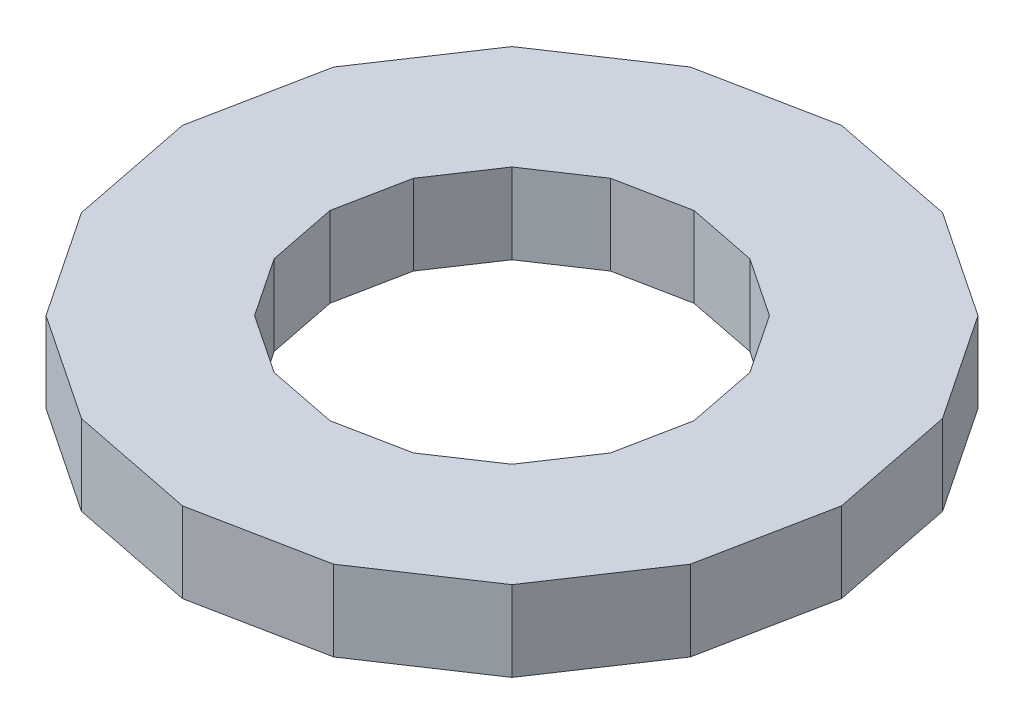
ISO-10303-21;
HEADER;
FILE_DESCRIPTION(('STEP AP214'),'2;1');
FILE_NAME('part.step','',(''),(''),'','','');
FILE_SCHEMA(('AUTOMOTIVE_DESIGN { 1 0 10303 214 1 1 1 1 }'));
ENDSEC;
DATA;
#1=APPLICATION_CONTEXT('core data for automotive mechanical design processes');
#2=APPLICATION_PROTOCOL_DEFINITION('international standard','automotive_design',2000,#1);
#3=PRODUCT_CONTEXT('',#1,'mechanical');
#4=PRODUCT('Part','Part','',(#3));
#5=PRODUCT_RELATED_PRODUCT_CATEGORY('part','',(#4));
#6=PRODUCT_DEFINITION_FORMATION('','',#4);
#7=PRODUCT_DEFINITION_CONTEXT('part definition',#1,'design');
#8=PRODUCT_DEFINITION('design','',#6,#7);
#9=PRODUCT_DEFINITION_SHAPE('','',#8);
#10=(LENGTH_UNIT() NAMED_UNIT(*) SI_UNIT(.MILLI.,.METRE.));
#11=(NAMED_UNIT(*) PLANE_ANGLE_UNIT() SI_UNIT($,.RADIAN.));
#12=(NAMED_UNIT(*) SI_UNIT($,.STERADIAN.) SOLID_ANGLE_UNIT());
#13=UNCERTAINTY_MEASURE_WITH_UNIT(LENGTH_MEASURE(1.E-05),#10,'distance_accuracy_value','');
#14=(GEOMETRIC_REPRESENTATION_CONTEXT(3) GLOBAL_UNCERTAINTY_ASSIGNED_CONTEXT((#13)) GLOBAL_UNIT_ASSIGNED_CONTEXT((#10,
#11,#12)) REPRESENTATION_CONTEXT('',''));
#15=CARTESIAN_POINT('',(0.,0.,0.));
#16=DIRECTION('',(0.,0.,1.));
#17=DIRECTION('',(1.,0.,0.));
#18=AXIS2_PLACEMENT_3D('',#15,#16,#17);
#19=CARTESIAN_POINT('',(0.,19.05,0.));
#20=DIRECTION('',(0.,1.,0.));
#21=DIRECTION('',(0.,0.,1.));
#22=AXIS2_PLACEMENT_3D('',#19,#20,#21);
#23=PLANE('',#22);
#24=DIRECTION('',(-0.195090322016129,0.,0.98078528040323));
#25=VECTOR('',#24,1.);
#26=CARTESIAN_POINT('',(-72.1713098321094,19.05,-29.8943353466904));
#27=LINE('',#26,#25);
#28=CARTESIAN_POINT('',(-72.1713098321094,19.05,-29.8943353466904));
#29=VERTEX_POINT('',#28);
#30=CARTESIAN_POINT('',(-78.117662847161,19.05,0.));
#31=VERTEX_POINT('',#30);
#32=EDGE_CURVE('E363',#29,#31,#27,.T.);
#33=ORIENTED_EDGE('',*,*,#32,.T.);
#34=DIRECTION('',(0.195090322016128,0.,0.980785280403231));
#35=VECTOR('',#34,1.);
#36=CARTESIAN_POINT('',(-78.117662847161,19.05,0.));
#37=LINE('',#36,#35);
#38=CARTESIAN_POINT('',(-72.1713098321094,19.05,29.8943353466904));
#39=VERTEX_POINT('',#38);
#40=EDGE_CURVE('E366',#31,#39,#37,.T.);
#41=ORIENTED_EDGE('',*,*,#40,.T.);
#42=DIRECTION('',(0.555570233019602,0.,0.831469612302546));
#43=VECTOR('',#42,1.);
#44=CARTESIAN_POINT('',(-72.1713098321094,19.05,29.8943353466904));
#45=LINE('',#44,#43);
#46=CARTESIAN_POINT('',(-55.2375291296719,19.05,55.237529129672));
#47=VERTEX_POINT('',#46);
#48=EDGE_CURVE('E369',#39,#47,#45,.T.);
#49=ORIENTED_EDGE('',*,*,#48,.T.);
#50=DIRECTION('',(0.831469612302545,0.,0.555570233019603));
#51=VECTOR('',#50,1.);
#52=CARTESIAN_POINT('',(-55.2375291296719,19.05,55.237529129672));
#53=LINE('',#52,#51);
#54=CARTESIAN_POINT('',(-29.8943353466904,19.05,72.1713098321094));
#55=VERTEX_POINT('',#54);
#56=EDGE_CURVE('E371',#47,#55,#53,.T.);
#57=ORIENTED_EDGE('',*,*,#56,.T.);
#58=DIRECTION('',(0.98078528040323,0.,0.195090322016128));
#59=VECTOR('',#58,1.);
#60=CARTESIAN_POINT('',(-29.8943353466904,19.05,72.1713098321094));
#61=LINE('',#60,#59);
#62=CARTESIAN_POINT('',(0.,19.05,78.117662847161));
#63=VERTEX_POINT('',#62);
#64=EDGE_CURVE('E373',#55,#63,#61,.T.);
#65=ORIENTED_EDGE('',*,*,#64,.T.);
#66=DIRECTION('',(0.980785280403231,0.,-0.195090322016128));
#67=VECTOR('',#66,1.);
#68=CARTESIAN_POINT('',(0.,19.05,78.117662847161));
#69=LINE('',#68,#67);
#70=CARTESIAN_POINT('',(29.8943353466903,19.05,72.1713098321095));
#71=VERTEX_POINT('',#70);
#72=EDGE_CURVE('E375',#63,#71,#69,.T.);
#73=ORIENTED_EDGE('',*,*,#72,.T.);
#74=DIRECTION('',(0.831469612302545,0.,-0.555570233019602));
#75=VECTOR('',#74,1.);
#76=CARTESIAN_POINT('',(29.8943353466903,19.05,72.1713098321095));
#77=LINE('',#76,#75);
#78=CARTESIAN_POINT('',(55.2375291296719,19.05,55.237529129672));
#79=VERTEX_POINT('',#78);
#80=EDGE_CURVE('E377',#71,#79,#77,.T.);
#81=ORIENTED_EDGE('',*,*,#80,.T.);
#82=DIRECTION('',(0.555570233019602,0.,-0.831469612302545));
#83=VECTOR('',#82,1.);
#84=CARTESIAN_POINT('',(55.2375291296719,19.05,55.237529129672));
#85=LINE('',#84,#83);
#86=CARTESIAN_POINT('',(72.1713098321094,19.05,29.8943353466905));
#87=VERTEX_POINT('',#86);
#88=EDGE_CURVE('E379',#79,#87,#85,.T.);
#89=ORIENTED_EDGE('',*,*,#88,.T.);
#90=DIRECTION('',(0.195090322016128,0.,-0.980785280403231));
#91=VECTOR('',#90,1.);
#92=CARTESIAN_POINT('',(72.1713098321094,19.05,29.8943353466905));
#93=LINE('',#92,#91);
#94=CARTESIAN_POINT('',(78.117662847161,19.05,0.));
#95=VERTEX_POINT('',#94);
#96=EDGE_CURVE('E381',#87,#95,#93,.T.);
#97=ORIENTED_EDGE('',*,*,#96,.T.);
#98=DIRECTION('',(-0.195090322016127,0.,-0.980785280403231));
#99=VECTOR('',#98,1.);
#100=CARTESIAN_POINT('',(78.117662847161,19.05,0.));
#101=LINE('',#100,#99);
#102=CARTESIAN_POINT('',(72.1713098321094,19.05,-29.8943353466903));
#103=VERTEX_POINT('',#102);
#104=EDGE_CURVE('E383',#95,#103,#101,.T.);
#105=ORIENTED_EDGE('',*,*,#104,.T.);
#106=DIRECTION('',(-0.555570233019602,0.,-0.831469612302545));
#107=VECTOR('',#106,1.);
#108=CARTESIAN_POINT('',(72.1713098321094,19.05,-29.8943353466903));
#109=LINE('',#108,#107);
#110=CARTESIAN_POINT('',(55.237529129672,19.05,-55.2375291296719));
#111=VERTEX_POINT('',#110);
#112=EDGE_CURVE('E385',#103,#111,#109,.T.);
#113=ORIENTED_EDGE('',*,*,#112,.T.);
#114=DIRECTION('',(-0.831469612302545,0.,-0.555570233019603));
#115=VECTOR('',#114,1.);
#116=CARTESIAN_POINT('',(55.237529129672,19.05,-55.2375291296719));
#117=LINE('',#116,#115);
#118=CARTESIAN_POINT('',(29.8943353466904,19.05,-72.1713098321094));
#119=VERTEX_POINT('',#118);
#120=EDGE_CURVE('E387',#111,#119,#117,.T.);
#121=ORIENTED_EDGE('',*,*,#120,.T.);
#122=DIRECTION('',(-0.98078528040323,0.,-0.195090322016128));
#123=VECTOR('',#122,1.);
#124=CARTESIAN_POINT('',(29.8943353466904,19.05,-72.1713098321094));
#125=LINE('',#124,#123);
#126=CARTESIAN_POINT('',(0.,19.05,-78.1176628471609));
#127=VERTEX_POINT('',#126);
#128=EDGE_CURVE('E389',#119,#127,#125,.T.);
#129=ORIENTED_EDGE('',*,*,#128,.T.);
#130=DIRECTION('',(-0.980785280403231,0.,0.195090322016128));
#131=VECTOR('',#130,1.);
#132=CARTESIAN_POINT('',(0.,19.05,-78.1176628471609));
#133=LINE('',#132,#131);
#134=CARTESIAN_POINT('',(-29.8943353466904,19.05,-72.1713098321094));
#135=VERTEX_POINT('',#134);
#136=EDGE_CURVE('E391',#127,#135,#133,.T.);
#137=ORIENTED_EDGE('',*,*,#136,.T.);
#138=DIRECTION('',(-0.831469612302546,0.,0.555570233019601));
#139=VECTOR('',#138,1.);
#140=CARTESIAN_POINT('',(-29.8943353466904,19.05,-72.1713098321094));
#141=LINE('',#140,#139);
#142=CARTESIAN_POINT('',(-55.2375291296719,19.05,-55.237529129672));
#143=VERTEX_POINT('',#142);
#144=EDGE_CURVE('E393',#135,#143,#141,.T.);
#145=ORIENTED_EDGE('',*,*,#144,.T.);
#146=DIRECTION('',(-0.555570233019602,0.,0.831469612302545));
#147=VECTOR('',#146,1.);
#148=CARTESIAN_POINT('',(-55.2375291296719,19.05,-55.237529129672));
#149=LINE('',#148,#147);
#150=EDGE_CURVE('E395',#143,#29,#149,.T.);
#151=ORIENTED_EDGE('',*,*,#150,.T.);
#152=EDGE_LOOP('',(#33,#41,#49,#57,#65,#73,#81,#89,#97,#105,#113,#121,#129,#137,#145,#151));
#153=FACE_BOUND('',#152,.T.);
#154=DIRECTION('',(0.195090322016128,0.,0.980785280403231));
#155=VECTOR('',#154,1.);
#156=CARTESIAN_POINT('',(-43.1558820321981,19.05,0.));
#157=LINE('',#156,#155);
#158=CARTESIAN_POINT('',(-43.1558820321981,19.05,0.));
#159=VERTEX_POINT('',#158);
#160=CARTESIAN_POINT('',(-39.8708361170195,19.05,16.5150410628245));
#161=VERTEX_POINT('',#160);
#162=EDGE_CURVE('E250',#159,#161,#157,.T.);
#163=ORIENTED_EDGE('',*,*,#162,.F.);
#164=DIRECTION('',(-0.195090322016127,0.,0.980785280403231));
#165=VECTOR('',#164,1.);
#166=CARTESIAN_POINT('',(-39.8708361170195,19.05,-16.5150410628244));
#167=LINE('',#166,#165);
#168=CARTESIAN_POINT('',(-39.8708361170195,19.05,-16.5150410628244));
#169=VERTEX_POINT('',#168);
#170=EDGE_CURVE('E242',#169,#159,#167,.T.);
#171=ORIENTED_EDGE('',*,*,#170,.F.);
#172=DIRECTION('',(-0.555570233019601,0.,0.831469612302546));
#173=VECTOR('',#172,1.);
#174=CARTESIAN_POINT('',(-30.515816833054,19.05,-30.515816833054));
#175=LINE('',#174,#173);
#176=CARTESIAN_POINT('',(-30.515816833054,19.05,-30.515816833054));
#177=VERTEX_POINT('',#176);
#178=EDGE_CURVE('E291',#177,#169,#175,.T.);
#179=ORIENTED_EDGE('',*,*,#178,.F.);
#180=DIRECTION('',(-0.831469612302545,0.,0.555570233019603));
#181=VECTOR('',#180,1.);
#182=CARTESIAN_POINT('',(-16.5150410628245,19.05,-39.8708361170195));
#183=LINE('',#182,#181);
#184=CARTESIAN_POINT('',(-16.5150410628245,19.05,-39.8708361170195));
#185=VERTEX_POINT('',#184);
#186=EDGE_CURVE('E289',#185,#177,#183,.T.);
#187=ORIENTED_EDGE('',*,*,#186,.F.);
#188=DIRECTION('',(-0.98078528040323,0.,0.195090322016129));
#189=VECTOR('',#188,1.);
#190=CARTESIAN_POINT('',(0.,19.05,-43.1558820321982));
#191=LINE('',#190,#189);
#192=CARTESIAN_POINT('',(0.,19.05,-43.1558820321982));
#193=VERTEX_POINT('',#192);
#194=EDGE_CURVE('E287',#193,#185,#191,.T.);
#195=ORIENTED_EDGE('',*,*,#194,.F.);
#196=DIRECTION('',(-0.980785280403231,0.,-0.195090322016128));
#197=VECTOR('',#196,1.);
#198=CARTESIAN_POINT('',(16.5150410628244,19.05,-39.8708361170195));
#199=LINE('',#198,#197);
#200=CARTESIAN_POINT('',(16.5150410628244,19.05,-39.8708361170195));
#201=VERTEX_POINT('',#200);
#202=EDGE_CURVE('E285',#201,#193,#199,.T.);
#203=ORIENTED_EDGE('',*,*,#202,.F.);
#204=DIRECTION('',(-0.831469612302546,0.,-0.555570233019601));
#205=VECTOR('',#204,1.);
#206=CARTESIAN_POINT('',(30.5158168330539,19.05,-30.515816833054));
#207=LINE('',#206,#205);
#208=CARTESIAN_POINT('',(30.5158168330539,19.05,-30.515816833054));
#209=VERTEX_POINT('',#208);
#210=EDGE_CURVE('E283',#209,#201,#207,.T.);
#211=ORIENTED_EDGE('',*,*,#210,.F.);
#212=DIRECTION('',(-0.555570233019603,0.,-0.831469612302545));
#213=VECTOR('',#212,1.);
#214=CARTESIAN_POINT('',(39.8708361170194,19.05,-16.5150410628245));
#215=LINE('',#214,#213);
#216=CARTESIAN_POINT('',(39.8708361170194,19.05,-16.5150410628245));
#217=VERTEX_POINT('',#216);
#218=EDGE_CURVE('E281',#217,#209,#215,.T.);
#219=ORIENTED_EDGE('',*,*,#218,.F.);
#220=DIRECTION('',(-0.195090322016129,0.,-0.98078528040323));
#221=VECTOR('',#220,1.);
#222=CARTESIAN_POINT('',(43.1558820321981,19.05,0.));
#223=LINE('',#222,#221);
#224=CARTESIAN_POINT('',(43.1558820321981,19.05,0.));
#225=VERTEX_POINT('',#224);
#226=EDGE_CURVE('E279',#225,#217,#223,.T.);
#227=ORIENTED_EDGE('',*,*,#226,.F.);
#228=DIRECTION('',(0.195090322016128,0.,-0.980785280403231));
#229=VECTOR('',#228,1.);
#230=CARTESIAN_POINT('',(39.8708361170195,19.05,16.5150410628245));
#231=LINE('',#230,#229);
#232=CARTESIAN_POINT('',(39.8708361170195,19.05,16.5150410628245));
#233=VERTEX_POINT('',#232);
#234=EDGE_CURVE('E277',#233,#225,#231,.T.);
#235=ORIENTED_EDGE('',*,*,#234,.F.);
#236=DIRECTION('',(0.555570233019601,0.,-0.831469612302546));
#237=VECTOR('',#236,1.);
#238=CARTESIAN_POINT('',(30.515816833054,19.05,30.515816833054));
#239=LINE('',#238,#237);
#240=CARTESIAN_POINT('',(30.515816833054,19.05,30.515816833054));
#241=VERTEX_POINT('',#240);
#242=EDGE_CURVE('E275',#241,#233,#239,.T.);
#243=ORIENTED_EDGE('',*,*,#242,.F.);
#244=DIRECTION('',(0.831469612302545,0.,-0.555570233019603));
#245=VECTOR('',#244,1.);
#246=CARTESIAN_POINT('',(16.5150410628245,19.05,39.8708361170194));
#247=LINE('',#246,#245);
#248=CARTESIAN_POINT('',(16.5150410628245,19.05,39.8708361170194));
#249=VERTEX_POINT('',#248);
#250=EDGE_CURVE('E273',#249,#241,#247,.T.);
#251=ORIENTED_EDGE('',*,*,#250,.F.);
#252=DIRECTION('',(0.98078528040323,0.,-0.195090322016129));
#253=VECTOR('',#252,1.);
#254=CARTESIAN_POINT('',(0.,19.05,43.1558820321981));
#255=LINE('',#254,#253);
#256=CARTESIAN_POINT('',(0.,19.05,43.1558820321981));
#257=VERTEX_POINT('',#256);
#258=EDGE_CURVE('E271',#257,#249,#255,.T.);
#259=ORIENTED_EDGE('',*,*,#258,.F.);
#260=DIRECTION('',(0.980785280403231,0.,0.195090322016127));
#261=VECTOR('',#260,1.);
#262=CARTESIAN_POINT('',(-16.5150410628244,19.05,39.8708361170195));
#263=LINE('',#262,#261);
#264=CARTESIAN_POINT('',(-16.5150410628244,19.05,39.8708361170195));
#265=VERTEX_POINT('',#264);
#266=EDGE_CURVE('E269',#265,#257,#263,.T.);
#267=ORIENTED_EDGE('',*,*,#266,.F.);
#268=DIRECTION('',(0.831469612302546,0.,0.555570233019601));
#269=VECTOR('',#268,1.);
#270=CARTESIAN_POINT('',(-30.515816833054,19.05,30.515816833054));
#271=LINE('',#270,#269);
#272=CARTESIAN_POINT('',(-30.515816833054,19.05,30.515816833054));
#273=VERTEX_POINT('',#272);
#274=EDGE_CURVE('E265',#273,#265,#271,.T.);
#275=ORIENTED_EDGE('',*,*,#274,.F.);
#276=DIRECTION('',(0.555570233019603,0.,0.831469612302544));
#277=VECTOR('',#276,1.);
#278=CARTESIAN_POINT('',(-39.8708361170195,19.05,16.5150410628245));
#279=LINE('',#278,#277);
#280=EDGE_CURVE('E263',#161,#273,#279,.T.);
#281=ORIENTED_EDGE('',*,*,#280,.F.);
#282=EDGE_LOOP('',(#163,#171,#179,#187,#195,#203,#211,#219,#227,#235,#243,#251,#259,#267,#275,#281));
#283=FACE_BOUND('',#282,.T.);
#284=ADVANCED_FACE('F33',(#153,#283),#23,.T.);
#285=CARTESIAN_POINT('',(0.,0.,0.));
#286=DIRECTION('',(0.,1.,0.));
#287=DIRECTION('',(0.,0.,1.));
#288=AXIS2_PLACEMENT_3D('',#285,#286,#287);
#289=PLANE('',#288);
#290=DIRECTION('',(-0.195090322016129,0.,0.98078528040323));
#291=VECTOR('',#290,1.);
#292=CARTESIAN_POINT('',(-72.1713098321094,0.,-29.8943353466904));
#293=LINE('',#292,#291);
#294=CARTESIAN_POINT('',(-72.1713098321094,0.,-29.8943353466904));
#295=VERTEX_POINT('',#294);
#296=CARTESIAN_POINT('',(-78.117662847161,0.,0.));
#297=VERTEX_POINT('',#296);
#298=EDGE_CURVE('E258',#295,#297,#293,.T.);
#299=ORIENTED_EDGE('',*,*,#298,.F.);
#300=DIRECTION('',(-0.555570233019602,0.,0.831469612302545));
#301=VECTOR('',#300,1.);
#302=CARTESIAN_POINT('',(-55.2375291296719,0.,-55.237529129672));
#303=LINE('',#302,#301);
#304=CARTESIAN_POINT('',(-55.2375291296719,0.,-55.237529129672));
#305=VERTEX_POINT('',#304);
#306=EDGE_CURVE('E367',#305,#295,#303,.T.);
#307=ORIENTED_EDGE('',*,*,#306,.F.);
#308=DIRECTION('',(-0.831469612302546,0.,0.555570233019601));
#309=VECTOR('',#308,1.);
#310=CARTESIAN_POINT('',(-29.8943353466904,0.,-72.1713098321094));
#311=LINE('',#310,#309);
#312=CARTESIAN_POINT('',(-29.8943353466904,0.,-72.1713098321094));
#313=VERTEX_POINT('',#312);
#314=EDGE_CURVE('E426',#313,#305,#311,.T.);
#315=ORIENTED_EDGE('',*,*,#314,.F.);
#316=DIRECTION('',(-0.980785280403231,0.,0.195090322016128));
#317=VECTOR('',#316,1.);
#318=CARTESIAN_POINT('',(0.,0.,-78.1176628471609));
#319=LINE('',#318,#317);
#320=CARTESIAN_POINT('',(0.,0.,-78.1176628471609));
#321=VERTEX_POINT('',#320);
#322=EDGE_CURVE('E424',#321,#313,#319,.T.);
#323=ORIENTED_EDGE('',*,*,#322,.F.);
#324=DIRECTION('',(-0.98078528040323,0.,-0.195090322016128));
#325=VECTOR('',#324,1.);
#326=CARTESIAN_POINT('',(29.8943353466904,0.,-72.1713098321094));
#327=LINE('',#326,#325);
#328=CARTESIAN_POINT('',(29.8943353466904,0.,-72.1713098321094));
#329=VERTEX_POINT('',#328);
#330=EDGE_CURVE('E422',#329,#321,#327,.T.);
#331=ORIENTED_EDGE('',*,*,#330,.F.);
#332=DIRECTION('',(-0.831469612302545,0.,-0.555570233019603));
#333=VECTOR('',#332,1.);
#334=CARTESIAN_POINT('',(55.237529129672,0.,-55.2375291296719));
#335=LINE('',#334,#333);
#336=CARTESIAN_POINT('',(55.237529129672,0.,-55.2375291296719));
#337=VERTEX_POINT('',#336);
#338=EDGE_CURVE('E420',#337,#329,#335,.T.);
#339=ORIENTED_EDGE('',*,*,#338,.F.);
#340=DIRECTION('',(-0.555570233019602,0.,-0.831469612302545));
#341=VECTOR('',#340,1.);
#342=CARTESIAN_POINT('',(72.1713098321094,0.,-29.8943353466903));
#343=LINE('',#342,#341);
#344=CARTESIAN_POINT('',(72.1713098321094,0.,-29.8943353466903));
#345=VERTEX_POINT('',#344);
#346=EDGE_CURVE('E418',#345,#337,#343,.T.);
#347=ORIENTED_EDGE('',*,*,#346,.F.);
#348=DIRECTION('',(-0.195090322016127,0.,-0.980785280403231));
#349=VECTOR('',#348,1.);
#350=CARTESIAN_POINT('',(78.117662847161,0.,0.));
#351=LINE('',#350,#349);
#352=CARTESIAN_POINT('',(78.117662847161,0.,0.));
#353=VERTEX_POINT('',#352);
#354=EDGE_CURVE('E416',#353,#345,#351,.T.);
#355=ORIENTED_EDGE('',*,*,#354,.F.);
#356=DIRECTION('',(0.195090322016128,0.,-0.980785280403231));
#357=VECTOR('',#356,1.);
#358=CARTESIAN_POINT('',(72.1713098321094,0.,29.8943353466905));
#359=LINE('',#358,#357);
#360=CARTESIAN_POINT('',(72.1713098321094,0.,29.8943353466905));
#361=VERTEX_POINT('',#360);
#362=EDGE_CURVE('E414',#361,#353,#359,.T.);
#363=ORIENTED_EDGE('',*,*,#362,.F.);
#364=DIRECTION('',(0.555570233019602,0.,-0.831469612302545));
#365=VECTOR('',#364,1.);
#366=CARTESIAN_POINT('',(55.2375291296719,0.,55.237529129672));
#367=LINE('',#366,#365);
#368=CARTESIAN_POINT('',(55.2375291296719,0.,55.237529129672));
#369=VERTEX_POINT('',#368);
#370=EDGE_CURVE('E412',#369,#361,#367,.T.);
#371=ORIENTED_EDGE('',*,*,#370,.F.);
#372=DIRECTION('',(0.831469612302545,0.,-0.555570233019602));
#373=VECTOR('',#372,1.);
#374=CARTESIAN_POINT('',(29.8943353466903,0.,72.1713098321095));
#375=LINE('',#374,#373);
#376=CARTESIAN_POINT('',(29.8943353466903,0.,72.1713098321095));
#377=VERTEX_POINT('',#376);
#378=EDGE_CURVE('E410',#377,#369,#375,.T.);
#379=ORIENTED_EDGE('',*,*,#378,.F.);
#380=DIRECTION('',(0.980785280403231,0.,-0.195090322016128));
#381=VECTOR('',#380,1.);
#382=CARTESIAN_POINT('',(0.,0.,78.117662847161));
#383=LINE('',#382,#381);
#384=CARTESIAN_POINT('',(0.,0.,78.117662847161));
#385=VERTEX_POINT('',#384);
#386=EDGE_CURVE('E408',#385,#377,#383,.T.);
#387=ORIENTED_EDGE('',*,*,#386,.F.);
#388=DIRECTION('',(0.98078528040323,0.,0.195090322016128));
#389=VECTOR('',#388,1.);
#390=CARTESIAN_POINT('',(-29.8943353466904,0.,72.1713098321094));
#391=LINE('',#390,#389);
#392=CARTESIAN_POINT('',(-29.8943353466904,0.,72.1713098321094));
#393=VERTEX_POINT('',#392);
#394=EDGE_CURVE('E406',#393,#385,#391,.T.);
#395=ORIENTED_EDGE('',*,*,#394,.F.);
#396=DIRECTION('',(0.831469612302545,0.,0.555570233019603));
#397=VECTOR('',#396,1.);
#398=CARTESIAN_POINT('',(-55.2375291296719,0.,55.237529129672));
#399=LINE('',#398,#397);
#400=CARTESIAN_POINT('',(-55.2375291296719,0.,55.237529129672));
#401=VERTEX_POINT('',#400);
#402=EDGE_CURVE('E404',#401,#393,#399,.T.);
#403=ORIENTED_EDGE('',*,*,#402,.F.);
#404=DIRECTION('',(0.555570233019602,0.,0.831469612302546));
#405=VECTOR('',#404,1.);
#406=CARTESIAN_POINT('',(-72.1713098321094,0.,29.8943353466904));
#407=LINE('',#406,#405);
#408=CARTESIAN_POINT('',(-72.1713098321094,0.,29.8943353466904));
#409=VERTEX_POINT('',#408);
#410=EDGE_CURVE('E402',#409,#401,#407,.T.);
#411=ORIENTED_EDGE('',*,*,#410,.F.);
#412=DIRECTION('',(0.195090322016128,0.,0.980785280403231));
#413=VECTOR('',#412,1.);
#414=CARTESIAN_POINT('',(-78.117662847161,0.,0.));
#415=LINE('',#414,#413);
#416=EDGE_CURVE('E400',#297,#409,#415,.T.);
#417=ORIENTED_EDGE('',*,*,#416,.F.);
#418=EDGE_LOOP('',(#299,#307,#315,#323,#331,#339,#347,#355,#363,#371,#379,#387,#395,#403,#411,#417));
#419=FACE_BOUND('',#418,.T.);
#420=DIRECTION('',(-0.195090322016127,0.,0.980785280403231));
#421=VECTOR('',#420,1.);
#422=CARTESIAN_POINT('',(-39.8708361170195,0.,-16.5150410628244));
#423=LINE('',#422,#421);
#424=CARTESIAN_POINT('',(-39.8708361170195,0.,-16.5150410628244));
#425=VERTEX_POINT('',#424);
#426=CARTESIAN_POINT('',(-43.1558820321981,0.,0.));
#427=VERTEX_POINT('',#426);
#428=EDGE_CURVE('E56',#425,#427,#423,.T.);
#429=ORIENTED_EDGE('',*,*,#428,.T.);
#430=DIRECTION('',(0.195090322016128,0.,0.980785280403231));
#431=VECTOR('',#430,1.);
#432=CARTESIAN_POINT('',(-43.1558820321981,0.,0.));
#433=LINE('',#432,#431);
#434=CARTESIAN_POINT('',(-39.8708361170195,0.,16.5150410628245));
#435=VERTEX_POINT('',#434);
#436=EDGE_CURVE('E257',#427,#435,#433,.T.);
#437=ORIENTED_EDGE('',*,*,#436,.T.);
#438=DIRECTION('',(0.555570233019603,0.,0.831469612302544));
#439=VECTOR('',#438,1.);
#440=CARTESIAN_POINT('',(-39.8708361170195,0.,16.5150410628245));
#441=LINE('',#440,#439);
#442=CARTESIAN_POINT('',(-30.515816833054,0.,30.515816833054));
#443=VERTEX_POINT('',#442);
#444=EDGE_CURVE('E295',#435,#443,#441,.T.);
#445=ORIENTED_EDGE('',*,*,#444,.T.);
#446=DIRECTION('',(0.831469612302546,0.,0.555570233019601));
#447=VECTOR('',#446,1.);
#448=CARTESIAN_POINT('',(-30.515816833054,0.,30.515816833054));
#449=LINE('',#448,#447);
#450=CARTESIAN_POINT('',(-16.5150410628244,0.,39.8708361170195));
#451=VERTEX_POINT('',#450);
#452=EDGE_CURVE('E298',#443,#451,#449,.T.);
#453=ORIENTED_EDGE('',*,*,#452,.T.);
#454=DIRECTION('',(0.980785280403231,0.,0.195090322016127));
#455=VECTOR('',#454,1.);
#456=CARTESIAN_POINT('',(-16.5150410628244,0.,39.8708361170195));
#457=LINE('',#456,#455);
#458=CARTESIAN_POINT('',(0.,0.,43.1558820321981));
#459=VERTEX_POINT('',#458);
#460=EDGE_CURVE('E301',#451,#459,#457,.T.);
#461=ORIENTED_EDGE('',*,*,#460,.T.);
#462=DIRECTION('',(0.98078528040323,0.,-0.195090322016129));
#463=VECTOR('',#462,1.);
#464=CARTESIAN_POINT('',(0.,0.,43.1558820321981));
#465=LINE('',#464,#463);
#466=CARTESIAN_POINT('',(16.5150410628245,0.,39.8708361170194));
#467=VERTEX_POINT('',#466);
#468=EDGE_CURVE('E304',#459,#467,#465,.T.);
#469=ORIENTED_EDGE('',*,*,#468,.T.);
#470=DIRECTION('',(0.831469612302545,0.,-0.555570233019603));
#471=VECTOR('',#470,1.);
#472=CARTESIAN_POINT('',(16.5150410628245,0.,39.8708361170194));
#473=LINE('',#472,#471);
#474=CARTESIAN_POINT('',(30.515816833054,0.,30.515816833054));
#475=VERTEX_POINT('',#474);
#476=EDGE_CURVE('E307',#467,#475,#473,.T.);
#477=ORIENTED_EDGE('',*,*,#476,.T.);
#478=DIRECTION('',(0.555570233019601,0.,-0.831469612302546));
#479=VECTOR('',#478,1.);
#480=CARTESIAN_POINT('',(30.515816833054,0.,30.515816833054));
#481=LINE('',#480,#479);
#482=CARTESIAN_POINT('',(39.8708361170195,0.,16.5150410628245));
#483=VERTEX_POINT('',#482);
#484=EDGE_CURVE('E310',#475,#483,#481,.T.);
#485=ORIENTED_EDGE('',*,*,#484,.T.);
#486=DIRECTION('',(0.195090322016128,0.,-0.980785280403231));
#487=VECTOR('',#486,1.);
#488=CARTESIAN_POINT('',(39.8708361170195,0.,16.5150410628245));
#489=LINE('',#488,#487);
#490=CARTESIAN_POINT('',(43.1558820321981,0.,0.));
#491=VERTEX_POINT('',#490);
#492=EDGE_CURVE('E313',#483,#491,#489,.T.);
#493=ORIENTED_EDGE('',*,*,#492,.T.);
#494=DIRECTION('',(-0.195090322016129,0.,-0.98078528040323));
#495=VECTOR('',#494,1.);
#496=CARTESIAN_POINT('',(43.1558820321981,0.,0.));
#497=LINE('',#496,#495);
#498=CARTESIAN_POINT('',(39.8708361170194,0.,-16.5150410628245));
#499=VERTEX_POINT('',#498);
#500=EDGE_CURVE('E316',#491,#499,#497,.T.);
#501=ORIENTED_EDGE('',*,*,#500,.T.);
#502=DIRECTION('',(-0.555570233019603,0.,-0.831469612302545));
#503=VECTOR('',#502,1.);
#504=CARTESIAN_POINT('',(39.8708361170194,0.,-16.5150410628245));
#505=LINE('',#504,#503);
#506=CARTESIAN_POINT('',(30.5158168330539,0.,-30.515816833054));
#507=VERTEX_POINT('',#506);
#508=EDGE_CURVE('E319',#499,#507,#505,.T.);
#509=ORIENTED_EDGE('',*,*,#508,.T.);
#510=DIRECTION('',(-0.831469612302546,0.,-0.555570233019601));
#511=VECTOR('',#510,1.);
#512=CARTESIAN_POINT('',(30.5158168330539,0.,-30.515816833054));
#513=LINE('',#512,#511);
#514=CARTESIAN_POINT('',(16.5150410628244,0.,-39.8708361170195));
#515=VERTEX_POINT('',#514);
#516=EDGE_CURVE('E322',#507,#515,#513,.T.);
#517=ORIENTED_EDGE('',*,*,#516,.T.);
#518=DIRECTION('',(-0.980785280403231,0.,-0.195090322016128));
#519=VECTOR('',#518,1.);
#520=CARTESIAN_POINT('',(16.5150410628244,0.,-39.8708361170195));
#521=LINE('',#520,#519);
#522=CARTESIAN_POINT('',(0.,0.,-43.1558820321982));
#523=VERTEX_POINT('',#522);
#524=EDGE_CURVE('E325',#515,#523,#521,.T.);
#525=ORIENTED_EDGE('',*,*,#524,.T.);
#526=DIRECTION('',(-0.98078528040323,0.,0.195090322016129));
#527=VECTOR('',#526,1.);
#528=CARTESIAN_POINT('',(0.,0.,-43.1558820321982));
#529=LINE('',#528,#527);
#530=CARTESIAN_POINT('',(-16.5150410628245,0.,-39.8708361170195));
#531=VERTEX_POINT('',#530);
#532=EDGE_CURVE('E328',#523,#531,#529,.T.);
#533=ORIENTED_EDGE('',*,*,#532,.T.);
#534=DIRECTION('',(-0.831469612302545,0.,0.555570233019603));
#535=VECTOR('',#534,1.);
#536=CARTESIAN_POINT('',(-16.5150410628245,0.,-39.8708361170195));
#537=LINE('',#536,#535);
#538=CARTESIAN_POINT('',(-30.515816833054,0.,-30.515816833054));
#539=VERTEX_POINT('',#538);
#540=EDGE_CURVE('E331',#531,#539,#537,.T.);
#541=ORIENTED_EDGE('',*,*,#540,.T.);
#542=DIRECTION('',(-0.555570233019601,0.,0.831469612302546));
#543=VECTOR('',#542,1.);
#544=CARTESIAN_POINT('',(-30.515816833054,0.,-30.515816833054));
#545=LINE('',#544,#543);
#546=EDGE_CURVE('E251',#539,#425,#545,.T.);
#547=ORIENTED_EDGE('',*,*,#546,.T.);
#548=EDGE_LOOP('',(#429,#437,#445,#453,#461,#469,#477,#485,#493,#501,#509,#517,#525,#533,#541,#547));
#549=FACE_BOUND('',#548,.T.);
#550=ADVANCED_FACE('F480',(#419,#549),#289,.F.);
#551=CARTESIAN_POINT('',(-72.1713098321094,19.05,-29.8943353466904));
#552=DIRECTION('',(0.98078528040323,0.,0.195090322016129));
#553=DIRECTION('',(0.195090322016129,0.,-0.980785280403231));
#554=AXIS2_PLACEMENT_3D('',#551,#552,#553);
#555=PLANE('',#554);
#556=ORIENTED_EDGE('',*,*,#298,.T.);
#557=DIRECTION('',(0.,-1.,0.));
#558=VECTOR('',#557,1.);
#559=CARTESIAN_POINT('',(-78.117662847161,19.05,0.));
#560=LINE('',#559,#558);
#561=EDGE_CURVE('E11',#31,#297,#560,.T.);
#562=ORIENTED_EDGE('',*,*,#561,.F.);
#563=ORIENTED_EDGE('',*,*,#32,.F.);
#564=DIRECTION('',(0.,-1.,0.));
#565=VECTOR('',#564,1.);
#566=CARTESIAN_POINT('',(-72.1713098321094,19.05,-29.8943353466904));
#567=LINE('',#566,#565);
#568=EDGE_CURVE('E397',#29,#295,#567,.T.);
#569=ORIENTED_EDGE('',*,*,#568,.T.);
#570=EDGE_LOOP('',(#556,#562,#563,#569));
#571=FACE_BOUND('',#570,.T.);
#572=ADVANCED_FACE('F35',(#571),#555,.F.);
#573=CARTESIAN_POINT('',(-78.117662847161,19.05,0.));
#574=DIRECTION('',(0.980785280403231,0.,-0.195090322016128));
#575=DIRECTION('',(-0.195090322016128,0.,-0.980785280403231));
#576=AXIS2_PLACEMENT_3D('',#573,#574,#575);
#577=PLANE('',#576);
#578=ORIENTED_EDGE('',*,*,#416,.T.);
#579=DIRECTION('',(0.,-1.,0.));
#580=VECTOR('',#579,1.);
#581=CARTESIAN_POINT('',(-72.1713098321094,19.05,29.8943353466904));
#582=LINE('',#581,#580);
#583=EDGE_CURVE('E41',#39,#409,#582,.T.);
#584=ORIENTED_EDGE('',*,*,#583,.F.);
#585=ORIENTED_EDGE('',*,*,#40,.F.);
#586=ORIENTED_EDGE('',*,*,#561,.T.);
#587=EDGE_LOOP('',(#578,#584,#585,#586));
#588=FACE_BOUND('',#587,.T.);
#589=ADVANCED_FACE('F497',(#588),#577,.F.);
#590=CARTESIAN_POINT('',(-72.1713098321094,19.05,29.8943353466904));
#591=DIRECTION('',(0.831469612302545,0.,-0.555570233019602));
#592=DIRECTION('',(-0.555570233019602,0.,-0.831469612302545));
#593=AXIS2_PLACEMENT_3D('',#590,#591,#592);
#594=PLANE('',#593);
#595=ORIENTED_EDGE('',*,*,#410,.T.);
#596=DIRECTION('',(0.,-1.,0.));
#597=VECTOR('',#596,1.);
#598=CARTESIAN_POINT('',(-55.2375291296719,19.05,55.237529129672));
#599=LINE('',#598,#597);
#600=EDGE_CURVE('E467',#47,#401,#599,.T.);
#601=ORIENTED_EDGE('',*,*,#600,.F.);
#602=ORIENTED_EDGE('',*,*,#48,.F.);
#603=ORIENTED_EDGE('',*,*,#583,.T.);
#604=EDGE_LOOP('',(#595,#601,#602,#603));
#605=FACE_BOUND('',#604,.T.);
#606=ADVANCED_FACE('F474',(#605),#594,.F.);
#607=CARTESIAN_POINT('',(-55.2375291296719,19.05,55.237529129672));
#608=DIRECTION('',(0.555570233019603,0.,-0.831469612302545));
#609=DIRECTION('',(-0.831469612302545,0.,-0.555570233019603));
#610=AXIS2_PLACEMENT_3D('',#607,#608,#609);
#611=PLANE('',#610);
#612=ORIENTED_EDGE('',*,*,#402,.T.);
#613=DIRECTION('',(0.,-1.,0.));
#614=VECTOR('',#613,1.);
#615=CARTESIAN_POINT('',(-29.8943353466904,19.05,72.1713098321094));
#616=LINE('',#615,#614);
#617=EDGE_CURVE('E464',#55,#393,#616,.T.);
#618=ORIENTED_EDGE('',*,*,#617,.F.);
#619=ORIENTED_EDGE('',*,*,#56,.F.);
#620=ORIENTED_EDGE('',*,*,#600,.T.);
#621=EDGE_LOOP('',(#612,#618,#619,#620));
#622=FACE_BOUND('',#621,.T.);
#623=ADVANCED_FACE('F486',(#622),#611,.F.);
#624=CARTESIAN_POINT('',(-29.8943353466904,19.05,72.1713098321094));
#625=DIRECTION('',(0.195090322016128,0.,-0.980785280403231));
#626=DIRECTION('',(-0.980785280403231,0.,-0.195090322016128));
#627=AXIS2_PLACEMENT_3D('',#624,#625,#626);
#628=PLANE('',#627);
#629=ORIENTED_EDGE('',*,*,#394,.T.);
#630=DIRECTION('',(0.,-1.,0.));
#631=VECTOR('',#630,1.);
#632=CARTESIAN_POINT('',(0.,19.05,78.117662847161));
#633=LINE('',#632,#631);
#634=EDGE_CURVE('E461',#63,#385,#633,.T.);
#635=ORIENTED_EDGE('',*,*,#634,.F.);
#636=ORIENTED_EDGE('',*,*,#64,.F.);
#637=ORIENTED_EDGE('',*,*,#617,.T.);
#638=EDGE_LOOP('',(#629,#635,#636,#637));
#639=FACE_BOUND('',#638,.T.);
#640=ADVANCED_FACE('F490',(#639),#628,.F.);
#641=CARTESIAN_POINT('',(0.,19.05,78.117662847161));
#642=DIRECTION('',(-0.195090322016128,0.,-0.980785280403231));
#643=DIRECTION('',(-0.980785280403231,0.,0.195090322016128));
#644=AXIS2_PLACEMENT_3D('',#641,#642,#643);
#645=PLANE('',#644);
#646=ORIENTED_EDGE('',*,*,#386,.T.);
#647=DIRECTION('',(0.,-1.,0.));
#648=VECTOR('',#647,1.);
#649=CARTESIAN_POINT('',(29.8943353466903,19.05,72.1713098321095));
#650=LINE('',#649,#648);
#651=EDGE_CURVE('E458',#71,#377,#650,.T.);
#652=ORIENTED_EDGE('',*,*,#651,.F.);
#653=ORIENTED_EDGE('',*,*,#72,.F.);
#654=ORIENTED_EDGE('',*,*,#634,.T.);
#655=EDGE_LOOP('',(#646,#652,#653,#654));
#656=FACE_BOUND('',#655,.T.);
#657=ADVANCED_FACE('F550',(#656),#645,.F.);
#658=CARTESIAN_POINT('',(29.8943353466903,19.05,72.1713098321095));
#659=DIRECTION('',(-0.555570233019602,0.,-0.831469612302546));
#660=DIRECTION('',(-0.831469612302546,0.,0.555570233019602));
#661=AXIS2_PLACEMENT_3D('',#658,#659,#660);
#662=PLANE('',#661);
#663=ORIENTED_EDGE('',*,*,#378,.T.);
#664=DIRECTION('',(0.,-1.,0.));
#665=VECTOR('',#664,1.);
#666=CARTESIAN_POINT('',(55.2375291296719,19.05,55.237529129672));
#667=LINE('',#666,#665);
#668=EDGE_CURVE('E455',#79,#369,#667,.T.);
#669=ORIENTED_EDGE('',*,*,#668,.F.);
#670=ORIENTED_EDGE('',*,*,#80,.F.);
#671=ORIENTED_EDGE('',*,*,#651,.T.);
#672=EDGE_LOOP('',(#663,#669,#670,#671));
#673=FACE_BOUND('',#672,.T.);
#674=ADVANCED_FACE('F547',(#673),#662,.F.);
#675=CARTESIAN_POINT('',(55.2375291296719,19.05,55.237529129672));
#676=DIRECTION('',(-0.831469612302545,0.,-0.555570233019602));
#677=DIRECTION('',(-0.555570233019602,0.,0.831469612302545));
#678=AXIS2_PLACEMENT_3D('',#675,#676,#677);
#679=PLANE('',#678);
#680=ORIENTED_EDGE('',*,*,#370,.T.);
#681=DIRECTION('',(0.,-1.,0.));
#682=VECTOR('',#681,1.);
#683=CARTESIAN_POINT('',(72.1713098321094,19.05,29.8943353466905));
#684=LINE('',#683,#682);
#685=EDGE_CURVE('E452',#87,#361,#684,.T.);
#686=ORIENTED_EDGE('',*,*,#685,.F.);
#687=ORIENTED_EDGE('',*,*,#88,.F.);
#688=ORIENTED_EDGE('',*,*,#668,.T.);
#689=EDGE_LOOP('',(#680,#686,#687,#688));
#690=FACE_BOUND('',#689,.T.);
#691=ADVANCED_FACE('F543',(#690),#679,.F.);
#692=CARTESIAN_POINT('',(72.1713098321094,19.05,29.8943353466905));
#693=DIRECTION('',(-0.98078528040323,0.,-0.195090322016128));
#694=DIRECTION('',(-0.195090322016128,0.,0.980785280403231));
#695=AXIS2_PLACEMENT_3D('',#692,#693,#694);
#696=PLANE('',#695);
#697=ORIENTED_EDGE('',*,*,#362,.T.);
#698=DIRECTION('',(0.,-1.,0.));
#699=VECTOR('',#698,1.);
#700=CARTESIAN_POINT('',(78.117662847161,19.05,0.));
#701=LINE('',#700,#699);
#702=EDGE_CURVE('E449',#95,#353,#701,.T.);
#703=ORIENTED_EDGE('',*,*,#702,.F.);
#704=ORIENTED_EDGE('',*,*,#96,.F.);
#705=ORIENTED_EDGE('',*,*,#685,.T.);
#706=EDGE_LOOP('',(#697,#703,#704,#705));
#707=FACE_BOUND('',#706,.T.);
#708=ADVANCED_FACE('F539',(#707),#696,.F.);
#709=CARTESIAN_POINT('',(78.117662847161,19.05,0.));
#710=DIRECTION('',(-0.980785280403231,0.,0.195090322016127));
#711=DIRECTION('',(0.195090322016127,0.,0.980785280403231));
#712=AXIS2_PLACEMENT_3D('',#709,#710,#711);
#713=PLANE('',#712);
#714=ORIENTED_EDGE('',*,*,#354,.T.);
#715=DIRECTION('',(0.,-1.,0.));
#716=VECTOR('',#715,1.);
#717=CARTESIAN_POINT('',(72.1713098321094,19.05,-29.8943353466903));
#718=LINE('',#717,#716);
#719=EDGE_CURVE('E446',#103,#345,#718,.T.);
#720=ORIENTED_EDGE('',*,*,#719,.F.);
#721=ORIENTED_EDGE('',*,*,#104,.F.);
#722=ORIENTED_EDGE('',*,*,#702,.T.);
#723=EDGE_LOOP('',(#714,#720,#721,#722));
#724=FACE_BOUND('',#723,.T.);
#725=ADVANCED_FACE('F534',(#724),#713,.F.);
#726=CARTESIAN_POINT('',(72.1713098321094,19.05,-29.8943353466903));
#727=DIRECTION('',(-0.831469612302545,0.,0.555570233019602));
#728=DIRECTION('',(0.555570233019602,0.,0.831469612302545));
#729=AXIS2_PLACEMENT_3D('',#726,#727,#728);
#730=PLANE('',#729);
#731=ORIENTED_EDGE('',*,*,#346,.T.);
#732=DIRECTION('',(0.,-1.,0.));
#733=VECTOR('',#732,1.);
#734=CARTESIAN_POINT('',(55.237529129672,19.05,-55.2375291296719));
#735=LINE('',#734,#733);
#736=EDGE_CURVE('E443',#111,#337,#735,.T.);
#737=ORIENTED_EDGE('',*,*,#736,.F.);
#738=ORIENTED_EDGE('',*,*,#112,.F.);
#739=ORIENTED_EDGE('',*,*,#719,.T.);
#740=EDGE_LOOP('',(#731,#737,#738,#739));
#741=FACE_BOUND('',#740,.T.);
#742=ADVANCED_FACE('F528',(#741),#730,.F.);
#743=CARTESIAN_POINT('',(55.237529129672,19.05,-55.2375291296719));
#744=DIRECTION('',(-0.555570233019603,0.,0.831469612302545));
#745=DIRECTION('',(0.831469612302545,0.,0.555570233019603));
#746=AXIS2_PLACEMENT_3D('',#743,#744,#745);
#747=PLANE('',#746);
#748=ORIENTED_EDGE('',*,*,#338,.T.);
#749=DIRECTION('',(0.,-1.,0.));
#750=VECTOR('',#749,1.);
#751=CARTESIAN_POINT('',(29.8943353466904,19.05,-72.1713098321094));
#752=LINE('',#751,#750);
#753=EDGE_CURVE('E440',#119,#329,#752,.T.);
#754=ORIENTED_EDGE('',*,*,#753,.F.);
#755=ORIENTED_EDGE('',*,*,#120,.F.);
#756=ORIENTED_EDGE('',*,*,#736,.T.);
#757=EDGE_LOOP('',(#748,#754,#755,#756));
#758=FACE_BOUND('',#757,.T.);
#759=ADVANCED_FACE('F524',(#758),#747,.F.);
#760=CARTESIAN_POINT('',(29.8943353466904,19.05,-72.1713098321094));
#761=DIRECTION('',(-0.195090322016128,0.,0.980785280403231));
#762=DIRECTION('',(0.98078528040323,0.,0.195090322016128));
#763=AXIS2_PLACEMENT_3D('',#760,#761,#762);
#764=PLANE('',#763);
#765=ORIENTED_EDGE('',*,*,#330,.T.);
#766=DIRECTION('',(0.,-1.,0.));
#767=VECTOR('',#766,1.);
#768=CARTESIAN_POINT('',(0.,19.05,-78.1176628471609));
#769=LINE('',#768,#767);
#770=EDGE_CURVE('E437',#127,#321,#769,.T.);
#771=ORIENTED_EDGE('',*,*,#770,.F.);
#772=ORIENTED_EDGE('',*,*,#128,.F.);
#773=ORIENTED_EDGE('',*,*,#753,.T.);
#774=EDGE_LOOP('',(#765,#771,#772,#773));
#775=FACE_BOUND('',#774,.T.);
#776=ADVANCED_FACE('F519',(#775),#764,.F.);
#777=CARTESIAN_POINT('',(0.,19.05,-78.1176628471609));
#778=DIRECTION('',(0.195090322016128,0.,0.980785280403231));
#779=DIRECTION('',(0.980785280403231,0.,-0.195090322016128));
#780=AXIS2_PLACEMENT_3D('',#777,#778,#779);
#781=PLANE('',#780);
#782=ORIENTED_EDGE('',*,*,#322,.T.);
#783=DIRECTION('',(0.,-1.,0.));
#784=VECTOR('',#783,1.);
#785=CARTESIAN_POINT('',(-29.8943353466904,19.05,-72.1713098321094));
#786=LINE('',#785,#784);
#787=EDGE_CURVE('E434',#135,#313,#786,.T.);
#788=ORIENTED_EDGE('',*,*,#787,.F.);
#789=ORIENTED_EDGE('',*,*,#136,.F.);
#790=ORIENTED_EDGE('',*,*,#770,.T.);
#791=EDGE_LOOP('',(#782,#788,#789,#790));
#792=FACE_BOUND('',#791,.T.);
#793=ADVANCED_FACE('F513',(#792),#781,.F.);
#794=CARTESIAN_POINT('',(-29.8943353466904,19.05,-72.1713098321094));
#795=DIRECTION('',(0.555570233019601,0.,0.831469612302546));
#796=DIRECTION('',(0.831469612302546,0.,-0.555570233019601));
#797=AXIS2_PLACEMENT_3D('',#794,#795,#796);
#798=PLANE('',#797);
#799=ORIENTED_EDGE('',*,*,#314,.T.);
#800=DIRECTION('',(0.,-1.,0.));
#801=VECTOR('',#800,1.);
#802=CARTESIAN_POINT('',(-55.2375291296719,19.05,-55.237529129672));
#803=LINE('',#802,#801);
#804=EDGE_CURVE('E431',#143,#305,#803,.T.);
#805=ORIENTED_EDGE('',*,*,#804,.F.);
#806=ORIENTED_EDGE('',*,*,#144,.F.);
#807=ORIENTED_EDGE('',*,*,#787,.T.);
#808=EDGE_LOOP('',(#799,#805,#806,#807));
#809=FACE_BOUND('',#808,.T.);
#810=ADVANCED_FACE('F509',(#809),#798,.F.);
#811=CARTESIAN_POINT('',(-55.2375291296719,19.05,-55.237529129672));
#812=DIRECTION('',(0.831469612302545,0.,0.555570233019602));
#813=DIRECTION('',(0.555570233019602,0.,-0.831469612302545));
#814=AXIS2_PLACEMENT_3D('',#811,#812,#813);
#815=PLANE('',#814);
#816=ORIENTED_EDGE('',*,*,#306,.T.);
#817=ORIENTED_EDGE('',*,*,#568,.F.);
#818=ORIENTED_EDGE('',*,*,#150,.F.);
#819=ORIENTED_EDGE('',*,*,#804,.T.);
#820=EDGE_LOOP('',(#816,#817,#818,#819));
#821=FACE_BOUND('',#820,.T.);
#822=ADVANCED_FACE('F504',(#821),#815,.F.);
#823=CARTESIAN_POINT('',(-39.8708361170195,19.05,-16.5150410628244));
#824=DIRECTION('',(0.980785280403231,0.,0.195090322016127));
#825=DIRECTION('',(0.195090322016128,0.,-0.980785280403231));
#826=AXIS2_PLACEMENT_3D('',#823,#824,#825);
#827=PLANE('',#826);
#828=ORIENTED_EDGE('',*,*,#428,.F.);
#829=DIRECTION('',(0.,-1.,0.));
#830=VECTOR('',#829,1.);
#831=CARTESIAN_POINT('',(-39.8708361170195,19.05,-16.5150410628244));
#832=LINE('',#831,#830);
#833=EDGE_CURVE('E246',#169,#425,#832,.T.);
#834=ORIENTED_EDGE('',*,*,#833,.F.);
#835=ORIENTED_EDGE('',*,*,#170,.T.);
#836=DIRECTION('',(0.,-1.,0.));
#837=VECTOR('',#836,1.);
#838=CARTESIAN_POINT('',(-43.1558820321981,19.05,0.));
#839=LINE('',#838,#837);
#840=EDGE_CURVE('E245',#159,#427,#839,.T.);
#841=ORIENTED_EDGE('',*,*,#840,.T.);
#842=EDGE_LOOP('',(#828,#834,#835,#841));
#843=FACE_BOUND('',#842,.T.);
#844=ADVANCED_FACE('F244',(#843),#827,.T.);
#845=CARTESIAN_POINT('',(-43.1558820321981,19.05,0.));
#846=DIRECTION('',(0.98078528040323,0.,-0.195090322016128));
#847=DIRECTION('',(-0.195090322016128,0.,-0.980785280403231));
#848=AXIS2_PLACEMENT_3D('',#845,#846,#847);
#849=PLANE('',#848);
#850=ORIENTED_EDGE('',*,*,#436,.F.);
#851=ORIENTED_EDGE('',*,*,#840,.F.);
#852=ORIENTED_EDGE('',*,*,#162,.T.);
#853=DIRECTION('',(0.,-1.,0.));
#854=VECTOR('',#853,1.);
#855=CARTESIAN_POINT('',(-39.8708361170195,19.05,16.5150410628245));
#856=LINE('',#855,#854);
#857=EDGE_CURVE('E259',#161,#435,#856,.T.);
#858=ORIENTED_EDGE('',*,*,#857,.T.);
#859=EDGE_LOOP('',(#850,#851,#852,#858));
#860=FACE_BOUND('',#859,.T.);
#861=ADVANCED_FACE('F254',(#860),#849,.T.);
#862=CARTESIAN_POINT('',(-39.8708361170195,19.05,16.5150410628245));
#863=DIRECTION('',(0.831469612302545,0.,-0.555570233019604));
#864=DIRECTION('',(-0.555570233019603,0.,-0.831469612302544));
#865=AXIS2_PLACEMENT_3D('',#862,#863,#864);
#866=PLANE('',#865);
#867=ORIENTED_EDGE('',*,*,#444,.F.);
#868=ORIENTED_EDGE('',*,*,#857,.F.);
#869=ORIENTED_EDGE('',*,*,#280,.T.);
#870=DIRECTION('',(0.,-1.,0.));
#871=VECTOR('',#870,1.);
#872=CARTESIAN_POINT('',(-30.515816833054,19.05,30.515816833054));
#873=LINE('',#872,#871);
#874=EDGE_CURVE('E360',#273,#443,#873,.T.);
#875=ORIENTED_EDGE('',*,*,#874,.T.);
#876=EDGE_LOOP('',(#867,#868,#869,#875));
#877=FACE_BOUND('',#876,.T.);
#878=ADVANCED_FACE('F632',(#877),#866,.T.);
#879=CARTESIAN_POINT('',(-30.515816833054,19.05,30.515816833054));
#880=DIRECTION('',(0.555570233019601,0.,-0.831469612302546));
#881=DIRECTION('',(-0.831469612302546,0.,-0.555570233019601));
#882=AXIS2_PLACEMENT_3D('',#879,#880,#881);
#883=PLANE('',#882);
#884=ORIENTED_EDGE('',*,*,#452,.F.);
#885=ORIENTED_EDGE('',*,*,#874,.F.);
#886=ORIENTED_EDGE('',*,*,#274,.T.);
#887=DIRECTION('',(0.,-1.,0.));
#888=VECTOR('',#887,1.);
#889=CARTESIAN_POINT('',(-16.5150410628244,19.05,39.8708361170195));
#890=LINE('',#889,#888);
#891=EDGE_CURVE('E358',#265,#451,#890,.T.);
#892=ORIENTED_EDGE('',*,*,#891,.T.);
#893=EDGE_LOOP('',(#884,#885,#886,#892));
#894=FACE_BOUND('',#893,.T.);
#895=ADVANCED_FACE('F638',(#894),#883,.T.);
#896=CARTESIAN_POINT('',(-16.5150410628244,19.05,39.8708361170195));
#897=DIRECTION('',(0.195090322016127,0.,-0.980785280403231));
#898=DIRECTION('',(-0.980785280403231,0.,-0.195090322016127));
#899=AXIS2_PLACEMENT_3D('',#896,#897,#898);
#900=PLANE('',#899);
#901=ORIENTED_EDGE('',*,*,#460,.F.);
#902=ORIENTED_EDGE('',*,*,#891,.F.);
#903=ORIENTED_EDGE('',*,*,#266,.T.);
#904=DIRECTION('',(0.,-1.,0.));
#905=VECTOR('',#904,1.);
#906=CARTESIAN_POINT('',(0.,19.05,43.1558820321981));
#907=LINE('',#906,#905);
#908=EDGE_CURVE('E356',#257,#459,#907,.T.);
#909=ORIENTED_EDGE('',*,*,#908,.T.);
#910=EDGE_LOOP('',(#901,#902,#903,#909));
#911=FACE_BOUND('',#910,.T.);
#912=ADVANCED_FACE('F646',(#911),#900,.T.);
#913=CARTESIAN_POINT('',(0.,19.05,43.1558820321981));
#914=DIRECTION('',(-0.195090322016129,0.,-0.98078528040323));
#915=DIRECTION('',(-0.98078528040323,0.,0.195090322016129));
#916=AXIS2_PLACEMENT_3D('',#913,#914,#915);
#917=PLANE('',#916);
#918=ORIENTED_EDGE('',*,*,#468,.F.);
#919=ORIENTED_EDGE('',*,*,#908,.F.);
#920=ORIENTED_EDGE('',*,*,#258,.T.);
#921=DIRECTION('',(0.,-1.,0.));
#922=VECTOR('',#921,1.);
#923=CARTESIAN_POINT('',(16.5150410628245,19.05,39.8708361170194));
#924=LINE('',#923,#922);
#925=EDGE_CURVE('E354',#249,#467,#924,.T.);
#926=ORIENTED_EDGE('',*,*,#925,.T.);
#927=EDGE_LOOP('',(#918,#919,#920,#926));
#928=FACE_BOUND('',#927,.T.);
#929=ADVANCED_FACE('F654',(#928),#917,.T.);
#930=CARTESIAN_POINT('',(16.5150410628245,19.05,39.8708361170194));
#931=DIRECTION('',(-0.555570233019603,0.,-0.831469612302545));
#932=DIRECTION('',(-0.831469612302545,0.,0.555570233019603));
#933=AXIS2_PLACEMENT_3D('',#930,#931,#932);
#934=PLANE('',#933);
#935=ORIENTED_EDGE('',*,*,#476,.F.);
#936=ORIENTED_EDGE('',*,*,#925,.F.);
#937=ORIENTED_EDGE('',*,*,#250,.T.);
#938=DIRECTION('',(0.,-1.,0.));
#939=VECTOR('',#938,1.);
#940=CARTESIAN_POINT('',(30.515816833054,19.05,30.515816833054));
#941=LINE('',#940,#939);
#942=EDGE_CURVE('E352',#241,#475,#941,.T.);
#943=ORIENTED_EDGE('',*,*,#942,.T.);
#944=EDGE_LOOP('',(#935,#936,#937,#943));
#945=FACE_BOUND('',#944,.T.);
#946=ADVANCED_FACE('F662',(#945),#934,.T.);
#947=CARTESIAN_POINT('',(30.515816833054,19.05,30.515816833054));
#948=DIRECTION('',(-0.831469612302546,0.,-0.555570233019601));
#949=DIRECTION('',(-0.555570233019601,0.,0.831469612302546));
#950=AXIS2_PLACEMENT_3D('',#947,#948,#949);
#951=PLANE('',#950);
#952=ORIENTED_EDGE('',*,*,#484,.F.);
#953=ORIENTED_EDGE('',*,*,#942,.F.);
#954=ORIENTED_EDGE('',*,*,#242,.T.);
#955=DIRECTION('',(0.,-1.,0.));
#956=VECTOR('',#955,1.);
#957=CARTESIAN_POINT('',(39.8708361170195,19.05,16.5150410628245));
#958=LINE('',#957,#956);
#959=EDGE_CURVE('E350',#233,#483,#958,.T.);
#960=ORIENTED_EDGE('',*,*,#959,.T.);
#961=EDGE_LOOP('',(#952,#953,#954,#960));
#962=FACE_BOUND('',#961,.T.);
#963=ADVANCED_FACE('F670',(#962),#951,.T.);
#964=CARTESIAN_POINT('',(39.8708361170195,19.05,16.5150410628245));
#965=DIRECTION('',(-0.980785280403231,0.,-0.195090322016128));
#966=DIRECTION('',(-0.195090322016128,0.,0.980785280403231));
#967=AXIS2_PLACEMENT_3D('',#964,#965,#966);
#968=PLANE('',#967);
#969=ORIENTED_EDGE('',*,*,#492,.F.);
#970=ORIENTED_EDGE('',*,*,#959,.F.);
#971=ORIENTED_EDGE('',*,*,#234,.T.);
#972=DIRECTION('',(0.,-1.,0.));
#973=VECTOR('',#972,1.);
#974=CARTESIAN_POINT('',(43.1558820321981,19.05,0.));
#975=LINE('',#974,#973);
#976=EDGE_CURVE('E348',#225,#491,#975,.T.);
#977=ORIENTED_EDGE('',*,*,#976,.T.);
#978=EDGE_LOOP('',(#969,#970,#971,#977));
#979=FACE_BOUND('',#978,.T.);
#980=ADVANCED_FACE('F678',(#979),#968,.T.);
#981=CARTESIAN_POINT('',(43.1558820321981,19.05,0.));
#982=DIRECTION('',(-0.98078528040323,0.,0.195090322016129));
#983=DIRECTION('',(0.195090322016129,0.,0.98078528040323));
#984=AXIS2_PLACEMENT_3D('',#981,#982,#983);
#985=PLANE('',#984);
#986=ORIENTED_EDGE('',*,*,#500,.F.);
#987=ORIENTED_EDGE('',*,*,#976,.F.);
#988=ORIENTED_EDGE('',*,*,#226,.T.);
#989=DIRECTION('',(0.,-1.,0.));
#990=VECTOR('',#989,1.);
#991=CARTESIAN_POINT('',(39.8708361170194,19.05,-16.5150410628245));
#992=LINE('',#991,#990);
#993=EDGE_CURVE('E346',#217,#499,#992,.T.);
#994=ORIENTED_EDGE('',*,*,#993,.T.);
#995=EDGE_LOOP('',(#986,#987,#988,#994));
#996=FACE_BOUND('',#995,.T.);
#997=ADVANCED_FACE('F686',(#996),#985,.T.);
#998=CARTESIAN_POINT('',(39.8708361170194,19.05,-16.5150410628245));
#999=DIRECTION('',(-0.831469612302545,0.,0.555570233019603));
#1000=DIRECTION('',(0.555570233019603,0.,0.831469612302545));
#1001=AXIS2_PLACEMENT_3D('',#998,#999,#1000);
#1002=PLANE('',#1001);
#1003=ORIENTED_EDGE('',*,*,#508,.F.);
#1004=ORIENTED_EDGE('',*,*,#993,.F.);
#1005=ORIENTED_EDGE('',*,*,#218,.T.);
#1006=DIRECTION('',(0.,-1.,0.));
#1007=VECTOR('',#1006,1.);
#1008=CARTESIAN_POINT('',(30.5158168330539,19.05,-30.515816833054));
#1009=LINE('',#1008,#1007);
#1010=EDGE_CURVE('E344',#209,#507,#1009,.T.);
#1011=ORIENTED_EDGE('',*,*,#1010,.T.);
#1012=EDGE_LOOP('',(#1003,#1004,#1005,#1011));
#1013=FACE_BOUND('',#1012,.T.);
#1014=ADVANCED_FACE('F694',(#1013),#1002,.T.);
#1015=CARTESIAN_POINT('',(30.5158168330539,19.05,-30.515816833054));
#1016=DIRECTION('',(-0.555570233019601,0.,0.831469612302546));
#1017=DIRECTION('',(0.831469612302546,0.,0.555570233019601));
#1018=AXIS2_PLACEMENT_3D('',#1015,#1016,#1017);
#1019=PLANE('',#1018);
#1020=ORIENTED_EDGE('',*,*,#516,.F.);
#1021=ORIENTED_EDGE('',*,*,#1010,.F.);
#1022=ORIENTED_EDGE('',*,*,#210,.T.);
#1023=DIRECTION('',(0.,-1.,0.));
#1024=VECTOR('',#1023,1.);
#1025=CARTESIAN_POINT('',(16.5150410628244,19.05,-39.8708361170195));
#1026=LINE('',#1025,#1024);
#1027=EDGE_CURVE('E342',#201,#515,#1026,.T.);
#1028=ORIENTED_EDGE('',*,*,#1027,.T.);
#1029=EDGE_LOOP('',(#1020,#1021,#1022,#1028));
#1030=FACE_BOUND('',#1029,.T.);
#1031=ADVANCED_FACE('F702',(#1030),#1019,.T.);
#1032=CARTESIAN_POINT('',(16.5150410628244,19.05,-39.8708361170195));
#1033=DIRECTION('',(-0.195090322016128,0.,0.980785280403231));
#1034=DIRECTION('',(0.980785280403231,0.,0.195090322016128));
#1035=AXIS2_PLACEMENT_3D('',#1032,#1033,#1034);
#1036=PLANE('',#1035);
#1037=ORIENTED_EDGE('',*,*,#524,.F.);
#1038=ORIENTED_EDGE('',*,*,#1027,.F.);
#1039=ORIENTED_EDGE('',*,*,#202,.T.);
#1040=DIRECTION('',(0.,-1.,0.));
#1041=VECTOR('',#1040,1.);
#1042=CARTESIAN_POINT('',(0.,19.05,-43.1558820321982));
#1043=LINE('',#1042,#1041);
#1044=EDGE_CURVE('E340',#193,#523,#1043,.T.);
#1045=ORIENTED_EDGE('',*,*,#1044,.T.);
#1046=EDGE_LOOP('',(#1037,#1038,#1039,#1045));
#1047=FACE_BOUND('',#1046,.T.);
#1048=ADVANCED_FACE('F710',(#1047),#1036,.T.);
#1049=CARTESIAN_POINT('',(0.,19.05,-43.1558820321982));
#1050=DIRECTION('',(0.195090322016129,0.,0.98078528040323));
#1051=DIRECTION('',(0.98078528040323,0.,-0.195090322016129));
#1052=AXIS2_PLACEMENT_3D('',#1049,#1050,#1051);
#1053=PLANE('',#1052);
#1054=ORIENTED_EDGE('',*,*,#532,.F.);
#1055=ORIENTED_EDGE('',*,*,#1044,.F.);
#1056=ORIENTED_EDGE('',*,*,#194,.T.);
#1057=DIRECTION('',(0.,-1.,0.));
#1058=VECTOR('',#1057,1.);
#1059=CARTESIAN_POINT('',(-16.5150410628245,19.05,-39.8708361170195));
#1060=LINE('',#1059,#1058);
#1061=EDGE_CURVE('E338',#185,#531,#1060,.T.);
#1062=ORIENTED_EDGE('',*,*,#1061,.T.);
#1063=EDGE_LOOP('',(#1054,#1055,#1056,#1062));
#1064=FACE_BOUND('',#1063,.T.);
#1065=ADVANCED_FACE('F718',(#1064),#1053,.T.);
#1066=CARTESIAN_POINT('',(-16.5150410628245,19.05,-39.8708361170195));
#1067=DIRECTION('',(0.555570233019603,0.,0.831469612302545));
#1068=DIRECTION('',(0.831469612302545,0.,-0.555570233019603));
#1069=AXIS2_PLACEMENT_3D('',#1066,#1067,#1068);
#1070=PLANE('',#1069);
#1071=ORIENTED_EDGE('',*,*,#540,.F.);
#1072=ORIENTED_EDGE('',*,*,#1061,.F.);
#1073=ORIENTED_EDGE('',*,*,#186,.T.);
#1074=DIRECTION('',(0.,-1.,0.));
#1075=VECTOR('',#1074,1.);
#1076=CARTESIAN_POINT('',(-30.515816833054,19.05,-30.515816833054));
#1077=LINE('',#1076,#1075);
#1078=EDGE_CURVE('E48',#177,#539,#1077,.T.);
#1079=ORIENTED_EDGE('',*,*,#1078,.T.);
#1080=EDGE_LOOP('',(#1071,#1072,#1073,#1079));
#1081=FACE_BOUND('',#1080,.T.);
#1082=ADVANCED_FACE('F726',(#1081),#1070,.T.);
#1083=CARTESIAN_POINT('',(-30.515816833054,19.05,-30.515816833054));
#1084=DIRECTION('',(0.831469612302546,0.,0.555570233019601));
#1085=DIRECTION('',(0.555570233019601,0.,-0.831469612302546));
#1086=AXIS2_PLACEMENT_3D('',#1083,#1084,#1085);
#1087=PLANE('',#1086);
#1088=ORIENTED_EDGE('',*,*,#546,.F.);
#1089=ORIENTED_EDGE('',*,*,#1078,.F.);
#1090=ORIENTED_EDGE('',*,*,#178,.T.);
#1091=ORIENTED_EDGE('',*,*,#833,.T.);
#1092=EDGE_LOOP('',(#1088,#1089,#1090,#1091));
#1093=FACE_BOUND('',#1092,.T.);
#1094=ADVANCED_FACE('F734',(#1093),#1087,.T.);
#1095=CLOSED_SHELL('',(#284,#550,#572,#589,#606,#623,#640,#657,#674,#691,#708,#725,#742,#759,
#776,#793,#810,#822,#844,#861,#878,#895,#912,#929,#946,#963,#980,#997,#1014,#1031,#1048,#1065,
#1082,#1094));
#1096=MANIFOLD_SOLID_BREP('B2',#1095);
#1097=ADVANCED_BREP_SHAPE_REPRESENTATION('',(#18,#1096),#14);
#1098=SHAPE_DEFINITION_REPRESENTATION(#9,#1097);
ENDSEC;
END-ISO-10303-21;
